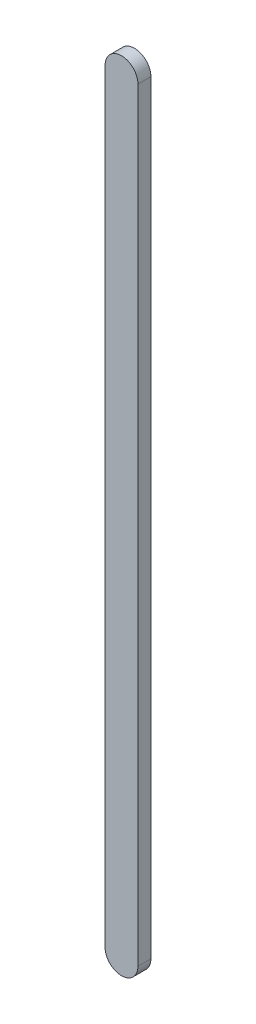
ISO-10303-21;
HEADER;
FILE_DESCRIPTION(('STEP AP214'),'2;1');
FILE_NAME('part.step','',(''),(''),'','','');
FILE_SCHEMA(('AUTOMOTIVE_DESIGN { 1 0 10303 214 1 1 1 1 }'));
ENDSEC;
DATA;
#1=APPLICATION_CONTEXT('core data for automotive mechanical design processes');
#2=APPLICATION_PROTOCOL_DEFINITION('international standard','automotive_design',2000,#1);
#3=PRODUCT_CONTEXT('',#1,'mechanical');
#4=PRODUCT('Part','Part','',(#3));
#5=PRODUCT_RELATED_PRODUCT_CATEGORY('part','',(#4));
#6=PRODUCT_DEFINITION_FORMATION('','',#4);
#7=PRODUCT_DEFINITION_CONTEXT('part definition',#1,'design');
#8=PRODUCT_DEFINITION('design','',#6,#7);
#9=PRODUCT_DEFINITION_SHAPE('','',#8);
#10=(LENGTH_UNIT() NAMED_UNIT(*) SI_UNIT(.MILLI.,.METRE.));
#11=(NAMED_UNIT(*) PLANE_ANGLE_UNIT() SI_UNIT($,.RADIAN.));
#12=(NAMED_UNIT(*) SI_UNIT($,.STERADIAN.) SOLID_ANGLE_UNIT());
#13=UNCERTAINTY_MEASURE_WITH_UNIT(LENGTH_MEASURE(1.E-05),#10,'distance_accuracy_value','');
#14=(GEOMETRIC_REPRESENTATION_CONTEXT(3) GLOBAL_UNCERTAINTY_ASSIGNED_CONTEXT((#13)) GLOBAL_UNIT_ASSIGNED_CONTEXT((#10,
#11,#12)) REPRESENTATION_CONTEXT('',''));
#15=CARTESIAN_POINT('',(0.,0.,0.));
#16=DIRECTION('',(0.,0.,1.));
#17=DIRECTION('',(1.,0.,0.));
#18=AXIS2_PLACEMENT_3D('',#15,#16,#17);
#19=CARTESIAN_POINT('',(154.813,104.394,0.));
#20=DIRECTION('',(-1.,0.,0.));
#21=DIRECTION('',(0.,1.,0.));
#22=AXIS2_PLACEMENT_3D('',#19,#20,#21);
#23=PLANE('',#22);
#24=DIRECTION('',(0.,1.,0.));
#25=VECTOR('',#24,1.);
#26=CARTESIAN_POINT('',(154.813,104.394,0.1999996));
#27=LINE('',#26,#25);
#28=CARTESIAN_POINT('',(154.813,104.394,0.1999996));
#29=VERTEX_POINT('',#28);
#30=CARTESIAN_POINT('',(154.813,116.205,0.1999996));
#31=VERTEX_POINT('',#30);
#32=EDGE_CURVE('E11',#29,#31,#27,.T.);
#33=ORIENTED_EDGE('',*,*,#32,.F.);
#34=DIRECTION('',(0.,0.,1.));
#35=VECTOR('',#34,1.);
#36=CARTESIAN_POINT('',(154.813,104.394,0.));
#37=LINE('',#36,#35);
#38=CARTESIAN_POINT('',(154.813,104.394,0.));
#39=VERTEX_POINT('',#38);
#40=EDGE_CURVE('E24',#39,#29,#37,.T.);
#41=ORIENTED_EDGE('',*,*,#40,.F.);
#42=DIRECTION('',(0.,1.,0.));
#43=VECTOR('',#42,1.);
#44=CARTESIAN_POINT('',(154.813,104.394,0.));
#45=LINE('',#44,#43);
#46=CARTESIAN_POINT('',(154.813,116.205,0.));
#47=VERTEX_POINT('',#46);
#48=EDGE_CURVE('E75',#39,#47,#45,.T.);
#49=ORIENTED_EDGE('',*,*,#48,.T.);
#50=DIRECTION('',(0.,0.,1.));
#51=VECTOR('',#50,1.);
#52=CARTESIAN_POINT('',(154.813,116.205,0.));
#53=LINE('',#52,#51);
#54=EDGE_CURVE('E37',#47,#31,#53,.T.);
#55=ORIENTED_EDGE('',*,*,#54,.T.);
#56=EDGE_LOOP('',(#33,#41,#49,#55));
#57=FACE_BOUND('',#56,.T.);
#58=ADVANCED_FACE('F17',(#57),#23,.F.);
#59=CARTESIAN_POINT('',(154.559,116.205,0.));
#60=DIRECTION('',(0.,0.,-1.));
#61=DIRECTION('',(1.,0.,0.));
#62=AXIS2_PLACEMENT_3D('',#59,#60,#61);
#63=CYLINDRICAL_SURFACE('',#62,0.253999999999991);
#64=CARTESIAN_POINT('',(154.559,116.205,0.1999996));
#65=DIRECTION('',(0.,0.,1.));
#66=DIRECTION('',(1.,0.,0.));
#67=AXIS2_PLACEMENT_3D('',#64,#65,#66);
#68=CIRCLE('',#67,0.253999999999991);
#69=CARTESIAN_POINT('',(154.305,116.205,0.1999996));
#70=VERTEX_POINT('',#69);
#71=EDGE_CURVE('E83',#31,#70,#68,.T.);
#72=ORIENTED_EDGE('',*,*,#71,.F.);
#73=ORIENTED_EDGE('',*,*,#54,.F.);
#74=CARTESIAN_POINT('',(154.559,116.205,0.));
#75=DIRECTION('',(0.,0.,1.));
#76=DIRECTION('',(1.,0.,0.));
#77=AXIS2_PLACEMENT_3D('',#74,#75,#76);
#78=CIRCLE('',#77,0.253999999999991);
#79=CARTESIAN_POINT('',(154.305,116.205,0.));
#80=VERTEX_POINT('',#79);
#81=EDGE_CURVE('E81',#47,#80,#78,.T.);
#82=ORIENTED_EDGE('',*,*,#81,.T.);
#83=DIRECTION('',(0.,0.,1.));
#84=VECTOR('',#83,1.);
#85=CARTESIAN_POINT('',(154.305,116.205,0.));
#86=LINE('',#85,#84);
#87=EDGE_CURVE('E67',#80,#70,#86,.T.);
#88=ORIENTED_EDGE('',*,*,#87,.T.);
#89=EDGE_LOOP('',(#72,#73,#82,#88));
#90=FACE_BOUND('',#89,.T.);
#91=ADVANCED_FACE('F89',(#90),#63,.T.);
#92=CARTESIAN_POINT('',(154.305,116.205,0.));
#93=DIRECTION('',(1.,0.,0.));
#94=DIRECTION('',(0.,-1.,0.));
#95=AXIS2_PLACEMENT_3D('',#92,#93,#94);
#96=PLANE('',#95);
#97=DIRECTION('',(0.,-1.,0.));
#98=VECTOR('',#97,1.);
#99=CARTESIAN_POINT('',(154.305,116.205,0.1999996));
#100=LINE('',#99,#98);
#101=CARTESIAN_POINT('',(154.305,104.394,0.1999996));
#102=VERTEX_POINT('',#101);
#103=EDGE_CURVE('E71',#70,#102,#100,.T.);
#104=ORIENTED_EDGE('',*,*,#103,.F.);
#105=ORIENTED_EDGE('',*,*,#87,.F.);
#106=DIRECTION('',(0.,-1.,0.));
#107=VECTOR('',#106,1.);
#108=CARTESIAN_POINT('',(154.305,116.205,0.));
#109=LINE('',#108,#107);
#110=CARTESIAN_POINT('',(154.305,104.394,0.));
#111=VERTEX_POINT('',#110);
#112=EDGE_CURVE('E63',#80,#111,#109,.T.);
#113=ORIENTED_EDGE('',*,*,#112,.T.);
#114=DIRECTION('',(0.,0.,1.));
#115=VECTOR('',#114,1.);
#116=CARTESIAN_POINT('',(154.305,104.394,0.));
#117=LINE('',#116,#115);
#118=EDGE_CURVE('E53',#111,#102,#117,.T.);
#119=ORIENTED_EDGE('',*,*,#118,.T.);
#120=EDGE_LOOP('',(#104,#105,#113,#119));
#121=FACE_BOUND('',#120,.T.);
#122=ADVANCED_FACE('F66',(#121),#96,.F.);
#123=CARTESIAN_POINT('',(154.559,104.394,0.));
#124=DIRECTION('',(0.,0.,-1.));
#125=DIRECTION('',(-1.,1.11896493820492E-13,0.));
#126=AXIS2_PLACEMENT_3D('',#123,#124,#125);
#127=CYLINDRICAL_SURFACE('',#126,0.253999999999986);
#128=CARTESIAN_POINT('',(154.559,104.394,0.1999996));
#129=DIRECTION('',(0.,0.,1.));
#130=DIRECTION('',(-1.,1.11896493820492E-13,0.));
#131=AXIS2_PLACEMENT_3D('',#128,#129,#130);
#132=CIRCLE('',#131,0.253999999999986);
#133=EDGE_CURVE('E59',#102,#29,#132,.T.);
#134=ORIENTED_EDGE('',*,*,#133,.F.);
#135=ORIENTED_EDGE('',*,*,#118,.F.);
#136=CARTESIAN_POINT('',(154.559,104.394,0.));
#137=DIRECTION('',(0.,0.,1.));
#138=DIRECTION('',(-1.,1.11896493820492E-13,0.));
#139=AXIS2_PLACEMENT_3D('',#136,#137,#138);
#140=CIRCLE('',#139,0.253999999999986);
#141=EDGE_CURVE('E57',#111,#39,#140,.T.);
#142=ORIENTED_EDGE('',*,*,#141,.T.);
#143=ORIENTED_EDGE('',*,*,#40,.T.);
#144=EDGE_LOOP('',(#134,#135,#142,#143));
#145=FACE_BOUND('',#144,.T.);
#146=ADVANCED_FACE('F55',(#145),#127,.T.);
#147=CARTESIAN_POINT('',(154.813,104.394,0.));
#148=DIRECTION('',(0.,0.,-1.));
#149=DIRECTION('',(-1.,0.,0.));
#150=AXIS2_PLACEMENT_3D('',#147,#148,#149);
#151=PLANE('',#150);
#152=ORIENTED_EDGE('',*,*,#141,.F.);
#153=ORIENTED_EDGE('',*,*,#112,.F.);
#154=ORIENTED_EDGE('',*,*,#81,.F.);
#155=ORIENTED_EDGE('',*,*,#48,.F.);
#156=EDGE_LOOP('',(#152,#153,#154,#155));
#157=FACE_BOUND('',#156,.T.);
#158=ADVANCED_FACE('F74',(#157),#151,.T.);
#159=CARTESIAN_POINT('',(154.813,104.394,0.1999996));
#160=DIRECTION('',(0.,0.,-1.));
#161=DIRECTION('',(-1.,0.,0.));
#162=AXIS2_PLACEMENT_3D('',#159,#160,#161);
#163=PLANE('',#162);
#164=ORIENTED_EDGE('',*,*,#32,.T.);
#165=ORIENTED_EDGE('',*,*,#71,.T.);
#166=ORIENTED_EDGE('',*,*,#103,.T.);
#167=ORIENTED_EDGE('',*,*,#133,.T.);
#168=EDGE_LOOP('',(#164,#165,#166,#167));
#169=FACE_BOUND('',#168,.T.);
#170=ADVANCED_FACE('F91',(#169),#163,.F.);
#171=CLOSED_SHELL('',(#58,#91,#122,#146,#158,#170));
#172=MANIFOLD_SOLID_BREP('B1',#171);
#173=ADVANCED_BREP_SHAPE_REPRESENTATION('',(#18,#172),#14);
#174=SHAPE_DEFINITION_REPRESENTATION(#9,#173);
ENDSEC;
END-ISO-10303-21;
